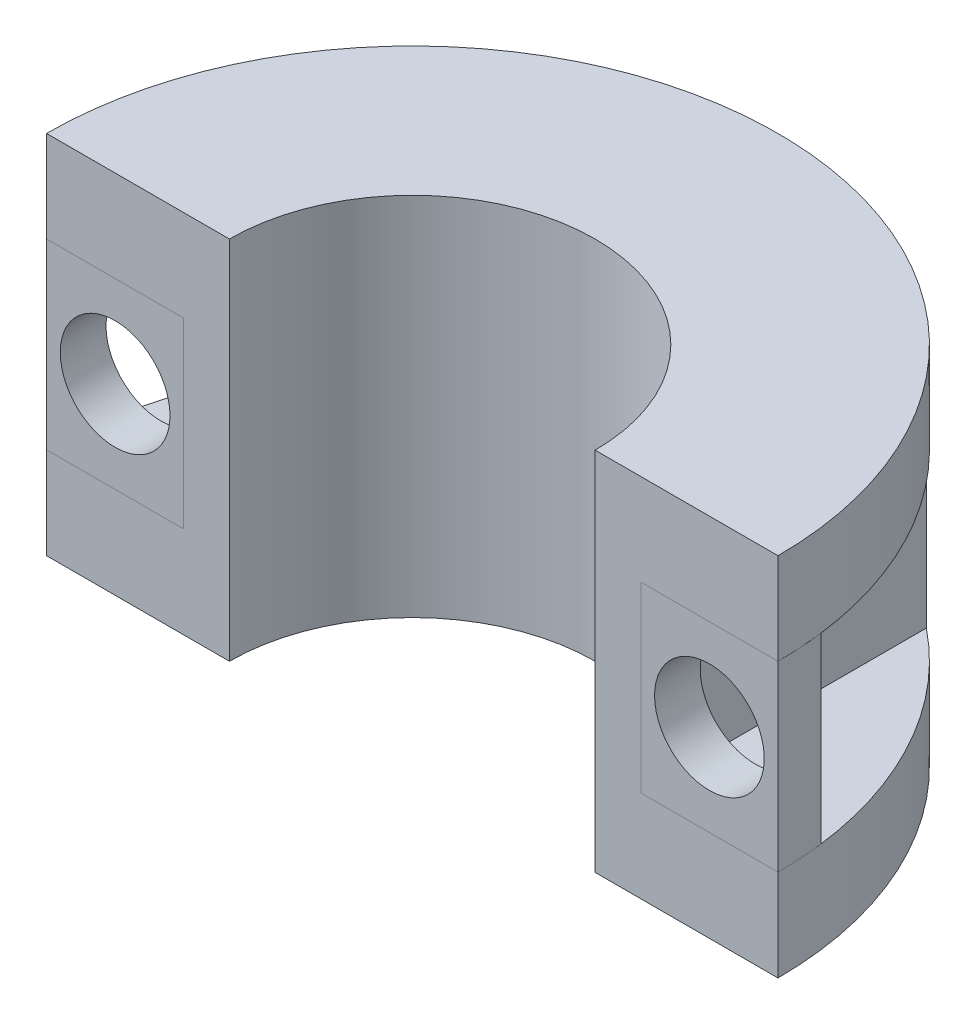
ISO-10303-21;
HEADER;
FILE_DESCRIPTION(('STEP AP214'),'2;1');
FILE_NAME('part.step','',(''),(''),'','','');
FILE_SCHEMA(('AUTOMOTIVE_DESIGN { 1 0 10303 214 1 1 1 1 }'));
ENDSEC;
DATA;
#1=APPLICATION_CONTEXT('core data for automotive mechanical design processes');
#2=APPLICATION_PROTOCOL_DEFINITION('international standard','automotive_design',2000,#1);
#3=PRODUCT_CONTEXT('',#1,'mechanical');
#4=PRODUCT('Part','Part','',(#3));
#5=PRODUCT_RELATED_PRODUCT_CATEGORY('part','',(#4));
#6=PRODUCT_DEFINITION_FORMATION('','',#4);
#7=PRODUCT_DEFINITION_CONTEXT('part definition',#1,'design');
#8=PRODUCT_DEFINITION('design','',#6,#7);
#9=PRODUCT_DEFINITION_SHAPE('','',#8);
#10=(LENGTH_UNIT() NAMED_UNIT(*) SI_UNIT(.MILLI.,.METRE.));
#11=(NAMED_UNIT(*) PLANE_ANGLE_UNIT() SI_UNIT($,.RADIAN.));
#12=(NAMED_UNIT(*) SI_UNIT($,.STERADIAN.) SOLID_ANGLE_UNIT());
#13=UNCERTAINTY_MEASURE_WITH_UNIT(LENGTH_MEASURE(1.E-05),#10,'distance_accuracy_value','');
#14=(GEOMETRIC_REPRESENTATION_CONTEXT(3) GLOBAL_UNCERTAINTY_ASSIGNED_CONTEXT((#13)) GLOBAL_UNIT_ASSIGNED_CONTEXT((#10,
#11,#12)) REPRESENTATION_CONTEXT('',''));
#15=CARTESIAN_POINT('',(0.,0.,0.));
#16=DIRECTION('',(0.,0.,1.));
#17=DIRECTION('',(1.,0.,0.));
#18=AXIS2_PLACEMENT_3D('',#15,#16,#17);
#19=CARTESIAN_POINT('',(5.,6.,0.500000000000001));
#20=DIRECTION('',(0.,1.,0.));
#21=DIRECTION('',(0.,0.,1.));
#22=AXIS2_PLACEMENT_3D('',#19,#20,#21);
#23=PLANE('',#22);
#24=DIRECTION('',(-1.,0.,0.));
#25=VECTOR('',#24,1.);
#26=CARTESIAN_POINT('',(5.,6.,1.5));
#27=LINE('',#26,#25);
#28=CARTESIAN_POINT('',(8.,6.,1.5));
#29=VERTEX_POINT('',#28);
#30=CARTESIAN_POINT('',(5.,6.,1.5));
#31=VERTEX_POINT('',#30);
#32=EDGE_CURVE('E85',#29,#31,#27,.T.);
#33=ORIENTED_EDGE('',*,*,#32,.F.);
#34=CARTESIAN_POINT('',(0.,6.,1.5));
#35=DIRECTION('',(0.,1.,0.));
#36=DIRECTION('',(0.,0.,1.));
#37=AXIS2_PLACEMENT_3D('',#34,#35,#36);
#38=CIRCLE('',#37,8.);
#39=CARTESIAN_POINT('',(7.93725393319377,6.,0.500000000000001));
#40=VERTEX_POINT('',#39);
#41=EDGE_CURVE('E80',#29,#40,#38,.T.);
#42=ORIENTED_EDGE('',*,*,#41,.T.);
#43=DIRECTION('',(-1.,0.,0.));
#44=VECTOR('',#43,1.);
#45=CARTESIAN_POINT('',(5.,6.,0.500000000000001));
#46=LINE('',#45,#44);
#47=CARTESIAN_POINT('',(5.,6.,0.500000000000001));
#48=VERTEX_POINT('',#47);
#49=EDGE_CURVE('E66',#40,#48,#46,.T.);
#50=ORIENTED_EDGE('',*,*,#49,.T.);
#51=DIRECTION('',(0.,0.,1.));
#52=VECTOR('',#51,1.);
#53=CARTESIAN_POINT('',(5.,6.,0.500000000000001));
#54=LINE('',#53,#52);
#55=EDGE_CURVE('E12',#48,#31,#54,.T.);
#56=ORIENTED_EDGE('',*,*,#55,.T.);
#57=EDGE_LOOP('',(#33,#42,#50,#56));
#58=FACE_BOUND('',#57,.T.);
#59=ADVANCED_FACE('F50',(#58),#23,.T.);
#60=CARTESIAN_POINT('',(5.,2.00614686848374,0.500000000000001));
#61=DIRECTION('',(0.,-1.,0.));
#62=DIRECTION('',(0.,0.,-1.));
#63=AXIS2_PLACEMENT_3D('',#60,#61,#62);
#64=PLANE('',#63);
#65=DIRECTION('',(1.,0.,0.));
#66=VECTOR('',#65,1.);
#67=CARTESIAN_POINT('',(5.,2.00614686848374,0.500000000000001));
#68=LINE('',#67,#66);
#69=CARTESIAN_POINT('',(5.,2.00614686848374,0.500000000000001));
#70=VERTEX_POINT('',#69);
#71=CARTESIAN_POINT('',(7.93725393319377,2.00614686848374,0.500000000000001));
#72=VERTEX_POINT('',#71);
#73=EDGE_CURVE('E100',#70,#72,#68,.T.);
#74=ORIENTED_EDGE('',*,*,#73,.T.);
#75=CARTESIAN_POINT('',(0.,2.00614686848374,1.5));
#76=DIRECTION('',(0.,-1.,0.));
#77=DIRECTION('',(0.,0.,-1.));
#78=AXIS2_PLACEMENT_3D('',#75,#76,#77);
#79=CIRCLE('',#78,8.);
#80=CARTESIAN_POINT('',(8.,2.00614686848374,1.5));
#81=VERTEX_POINT('',#80);
#82=EDGE_CURVE('E109',#72,#81,#79,.T.);
#83=ORIENTED_EDGE('',*,*,#82,.T.);
#84=DIRECTION('',(1.,0.,0.));
#85=VECTOR('',#84,1.);
#86=CARTESIAN_POINT('',(5.,2.00614686848374,1.5));
#87=LINE('',#86,#85);
#88=CARTESIAN_POINT('',(5.,2.00614686848374,1.5));
#89=VERTEX_POINT('',#88);
#90=EDGE_CURVE('E94',#89,#81,#87,.T.);
#91=ORIENTED_EDGE('',*,*,#90,.F.);
#92=DIRECTION('',(0.,0.,1.));
#93=VECTOR('',#92,1.);
#94=CARTESIAN_POINT('',(5.,2.00614686848374,0.500000000000001));
#95=LINE('',#94,#93);
#96=EDGE_CURVE('E54',#70,#89,#95,.T.);
#97=ORIENTED_EDGE('',*,*,#96,.F.);
#98=EDGE_LOOP('',(#74,#83,#91,#97));
#99=FACE_BOUND('',#98,.T.);
#100=ADVANCED_FACE('F133',(#99),#64,.T.);
#101=CARTESIAN_POINT('',(0.,0.,0.500000000000001));
#102=DIRECTION('',(0.,0.,1.));
#103=DIRECTION('',(1.,0.,0.));
#104=AXIS2_PLACEMENT_3D('',#101,#102,#103);
#105=PLANE('',#104);
#106=CARTESIAN_POINT('',(6.5,4.00307343424187,0.500000000000001));
#107=DIRECTION('',(0.,0.,-1.));
#108=DIRECTION('',(-1.,0.,0.));
#109=AXIS2_PLACEMENT_3D('',#106,#107,#108);
#110=CIRCLE('',#109,1.2);
#111=CARTESIAN_POINT('',(5.3,4.00307343424187,0.500000000000001));
#112=VERTEX_POINT('',#111);
#113=EDGE_CURVE('E116',#112,#112,#110,.T.);
#114=ORIENTED_EDGE('',*,*,#113,.F.);
#115=EDGE_LOOP('',(#114));
#116=FACE_BOUND('',#115,.T.);
#117=DIRECTION('',(0.,-1.,0.));
#118=VECTOR('',#117,1.);
#119=CARTESIAN_POINT('',(7.93725393319377,8.,0.500000000000001));
#120=LINE('',#119,#118);
#121=EDGE_CURVE('E112',#40,#72,#120,.T.);
#122=ORIENTED_EDGE('',*,*,#121,.T.);
#123=ORIENTED_EDGE('',*,*,#73,.F.);
#124=DIRECTION('',(0.,-1.,0.));
#125=VECTOR('',#124,1.);
#126=CARTESIAN_POINT('',(5.,6.,0.500000000000001));
#127=LINE('',#126,#125);
#128=EDGE_CURVE('E98',#48,#70,#127,.T.);
#129=ORIENTED_EDGE('',*,*,#128,.F.);
#130=ORIENTED_EDGE('',*,*,#49,.F.);
#131=EDGE_LOOP('',(#122,#123,#129,#130));
#132=FACE_BOUND('',#131,.T.);
#133=ADVANCED_FACE('F130',(#116,#132),#105,.F.);
#134=CARTESIAN_POINT('',(5.,6.,0.500000000000001));
#135=DIRECTION('',(-1.,0.,0.));
#136=DIRECTION('',(0.,0.,1.));
#137=AXIS2_PLACEMENT_3D('',#134,#135,#136);
#138=PLANE('',#137);
#139=DIRECTION('',(0.,-1.,0.));
#140=VECTOR('',#139,1.);
#141=CARTESIAN_POINT('',(5.,6.,1.5));
#142=LINE('',#141,#140);
#143=EDGE_CURVE('E90',#31,#89,#142,.T.);
#144=ORIENTED_EDGE('',*,*,#143,.F.);
#145=ORIENTED_EDGE('',*,*,#55,.F.);
#146=ORIENTED_EDGE('',*,*,#128,.T.);
#147=ORIENTED_EDGE('',*,*,#96,.T.);
#148=EDGE_LOOP('',(#144,#145,#146,#147));
#149=FACE_BOUND('',#148,.T.);
#150=ADVANCED_FACE('F52',(#149),#138,.T.);
#151=CARTESIAN_POINT('',(0.,0.,1.5));
#152=DIRECTION('',(0.,0.,1.));
#153=DIRECTION('',(1.,0.,0.));
#154=AXIS2_PLACEMENT_3D('',#151,#152,#153);
#155=PLANE('',#154);
#156=CARTESIAN_POINT('',(6.5,4.00307343424187,1.5));
#157=DIRECTION('',(0.,0.,-1.));
#158=DIRECTION('',(-1.,0.,0.));
#159=AXIS2_PLACEMENT_3D('',#156,#157,#158);
#160=CIRCLE('',#159,1.2);
#161=CARTESIAN_POINT('',(5.3,4.00307343424187,1.5));
#162=VERTEX_POINT('',#161);
#163=EDGE_CURVE('E115',#162,#162,#160,.T.);
#164=ORIENTED_EDGE('',*,*,#163,.T.);
#165=EDGE_LOOP('',(#164));
#166=FACE_BOUND('',#165,.T.);
#167=ORIENTED_EDGE('',*,*,#143,.T.);
#168=ORIENTED_EDGE('',*,*,#90,.T.);
#169=DIRECTION('',(0.,1.,0.));
#170=VECTOR('',#169,1.);
#171=CARTESIAN_POINT('',(8.,6.,1.5));
#172=LINE('',#171,#170);
#173=EDGE_CURVE('E97',#81,#29,#172,.T.);
#174=ORIENTED_EDGE('',*,*,#173,.T.);
#175=ORIENTED_EDGE('',*,*,#32,.T.);
#176=EDGE_LOOP('',(#167,#168,#174,#175));
#177=FACE_BOUND('',#176,.T.);
#178=ADVANCED_FACE('F96',(#166,#177),#155,.T.);
#179=CARTESIAN_POINT('',(0.,8.,1.5));
#180=DIRECTION('',(0.,-1.,0.));
#181=DIRECTION('',(0.,0.,-1.));
#182=AXIS2_PLACEMENT_3D('',#179,#180,#181);
#183=CYLINDRICAL_SURFACE('',#182,8.);
#184=ORIENTED_EDGE('',*,*,#173,.F.);
#185=ORIENTED_EDGE('',*,*,#82,.F.);
#186=ORIENTED_EDGE('',*,*,#121,.F.);
#187=ORIENTED_EDGE('',*,*,#41,.F.);
#188=EDGE_LOOP('',(#184,#185,#186,#187));
#189=FACE_BOUND('',#188,.T.);
#190=ADVANCED_FACE('F126',(#189),#183,.T.);
#191=CARTESIAN_POINT('',(6.5,4.00307343424187,1.5));
#192=DIRECTION('',(0.,0.,-1.));
#193=DIRECTION('',(-1.,0.,0.));
#194=AXIS2_PLACEMENT_3D('',#191,#192,#193);
#195=CYLINDRICAL_SURFACE('',#194,1.2);
#196=ORIENTED_EDGE('',*,*,#163,.F.);
#197=EDGE_LOOP('',(#196));
#198=FACE_BOUND('',#197,.T.);
#199=ORIENTED_EDGE('',*,*,#113,.T.);
#200=EDGE_LOOP('',(#199));
#201=FACE_BOUND('',#200,.T.);
#202=ADVANCED_FACE('F123',(#198,#201),#195,.F.);
#203=CLOSED_SHELL('',(#59,#100,#133,#150,#178,#190,#202));
#204=MANIFOLD_SOLID_BREP('B2',#203);
#205=CARTESIAN_POINT('',(-5.,2.00614686848374,0.500000000000001));
#206=DIRECTION('',(0.,-1.,0.));
#207=DIRECTION('',(0.,0.,-1.));
#208=AXIS2_PLACEMENT_3D('',#205,#206,#207);
#209=PLANE('',#208);
#210=DIRECTION('',(1.,0.,0.));
#211=VECTOR('',#210,1.);
#212=CARTESIAN_POINT('',(-5.,2.00614686848374,1.5));
#213=LINE('',#212,#211);
#214=CARTESIAN_POINT('',(-8.,2.00614686848374,1.5));
#215=VERTEX_POINT('',#214);
#216=CARTESIAN_POINT('',(-5.,2.00614686848374,1.5));
#217=VERTEX_POINT('',#216);
#218=EDGE_CURVE('E242',#215,#217,#213,.T.);
#219=ORIENTED_EDGE('',*,*,#218,.F.);
#220=CARTESIAN_POINT('',(0.,2.00614686848374,1.5));
#221=DIRECTION('',(0.,-1.,0.));
#222=DIRECTION('',(0.,0.,-1.));
#223=AXIS2_PLACEMENT_3D('',#220,#221,#222);
#224=CIRCLE('',#223,8.);
#225=CARTESIAN_POINT('',(-7.93725393319377,2.00614686848374,0.500000000000001));
#226=VERTEX_POINT('',#225);
#227=EDGE_CURVE('E237',#215,#226,#224,.T.);
#228=ORIENTED_EDGE('',*,*,#227,.T.);
#229=DIRECTION('',(1.,0.,0.));
#230=VECTOR('',#229,1.);
#231=CARTESIAN_POINT('',(-5.,2.00614686848374,0.500000000000001));
#232=LINE('',#231,#230);
#233=CARTESIAN_POINT('',(-5.,2.00614686848374,0.500000000000001));
#234=VERTEX_POINT('',#233);
#235=EDGE_CURVE('E223',#226,#234,#232,.T.);
#236=ORIENTED_EDGE('',*,*,#235,.T.);
#237=DIRECTION('',(0.,0.,1.));
#238=VECTOR('',#237,1.);
#239=CARTESIAN_POINT('',(-5.,2.00614686848374,0.500000000000001));
#240=LINE('',#239,#238);
#241=EDGE_CURVE('E48',#234,#217,#240,.T.);
#242=ORIENTED_EDGE('',*,*,#241,.T.);
#243=EDGE_LOOP('',(#219,#228,#236,#242));
#244=FACE_BOUND('',#243,.T.);
#245=ADVANCED_FACE('F207',(#244),#209,.T.);
#246=CARTESIAN_POINT('',(-5.,6.,0.500000000000001));
#247=DIRECTION('',(0.,1.,0.));
#248=DIRECTION('',(0.,0.,1.));
#249=AXIS2_PLACEMENT_3D('',#246,#247,#248);
#250=PLANE('',#249);
#251=DIRECTION('',(-1.,0.,0.));
#252=VECTOR('',#251,1.);
#253=CARTESIAN_POINT('',(-5.,6.,0.500000000000001));
#254=LINE('',#253,#252);
#255=CARTESIAN_POINT('',(-5.,6.,0.500000000000001));
#256=VERTEX_POINT('',#255);
#257=CARTESIAN_POINT('',(-7.93725393319377,6.,0.500000000000001));
#258=VERTEX_POINT('',#257);
#259=EDGE_CURVE('E257',#256,#258,#254,.T.);
#260=ORIENTED_EDGE('',*,*,#259,.T.);
#261=CARTESIAN_POINT('',(0.,6.,1.5));
#262=DIRECTION('',(0.,1.,0.));
#263=DIRECTION('',(0.,0.,1.));
#264=AXIS2_PLACEMENT_3D('',#261,#262,#263);
#265=CIRCLE('',#264,8.);
#266=CARTESIAN_POINT('',(-8.,6.,1.5));
#267=VERTEX_POINT('',#266);
#268=EDGE_CURVE('E266',#258,#267,#265,.T.);
#269=ORIENTED_EDGE('',*,*,#268,.T.);
#270=DIRECTION('',(-1.,0.,0.));
#271=VECTOR('',#270,1.);
#272=CARTESIAN_POINT('',(-5.,6.,1.5));
#273=LINE('',#272,#271);
#274=CARTESIAN_POINT('',(-5.,6.,1.5));
#275=VERTEX_POINT('',#274);
#276=EDGE_CURVE('E251',#275,#267,#273,.T.);
#277=ORIENTED_EDGE('',*,*,#276,.F.);
#278=DIRECTION('',(0.,0.,1.));
#279=VECTOR('',#278,1.);
#280=CARTESIAN_POINT('',(-5.,6.,0.500000000000001));
#281=LINE('',#280,#279);
#282=EDGE_CURVE('E211',#256,#275,#281,.T.);
#283=ORIENTED_EDGE('',*,*,#282,.F.);
#284=EDGE_LOOP('',(#260,#269,#277,#283));
#285=FACE_BOUND('',#284,.T.);
#286=ADVANCED_FACE('F289',(#285),#250,.T.);
#287=CARTESIAN_POINT('',(0.,0.,0.500000000000001));
#288=DIRECTION('',(0.,0.,-1.));
#289=DIRECTION('',(-1.,0.,0.));
#290=AXIS2_PLACEMENT_3D('',#287,#288,#289);
#291=PLANE('',#290);
#292=CARTESIAN_POINT('',(-6.5,4.00307343424187,0.500000000000001));
#293=DIRECTION('',(0.,0.,-1.));
#294=DIRECTION('',(-1.,0.,0.));
#295=AXIS2_PLACEMENT_3D('',#292,#293,#294);
#296=CIRCLE('',#295,1.2);
#297=CARTESIAN_POINT('',(-7.7,4.00307343424187,0.500000000000001));
#298=VERTEX_POINT('',#297);
#299=EDGE_CURVE('E272',#298,#298,#296,.T.);
#300=ORIENTED_EDGE('',*,*,#299,.F.);
#301=EDGE_LOOP('',(#300));
#302=FACE_BOUND('',#301,.T.);
#303=ORIENTED_EDGE('',*,*,#235,.F.);
#304=DIRECTION('',(0.,-1.,0.));
#305=VECTOR('',#304,1.);
#306=CARTESIAN_POINT('',(-7.93725393319377,8.,0.500000000000001));
#307=LINE('',#306,#305);
#308=EDGE_CURVE('E269',#258,#226,#307,.T.);
#309=ORIENTED_EDGE('',*,*,#308,.F.);
#310=ORIENTED_EDGE('',*,*,#259,.F.);
#311=DIRECTION('',(0.,1.,0.));
#312=VECTOR('',#311,1.);
#313=CARTESIAN_POINT('',(-5.,6.,0.500000000000001));
#314=LINE('',#313,#312);
#315=EDGE_CURVE('E255',#234,#256,#314,.T.);
#316=ORIENTED_EDGE('',*,*,#315,.F.);
#317=EDGE_LOOP('',(#303,#309,#310,#316));
#318=FACE_BOUND('',#317,.T.);
#319=ADVANCED_FACE('F286',(#302,#318),#291,.T.);
#320=CARTESIAN_POINT('',(-5.,6.,0.500000000000001));
#321=DIRECTION('',(1.,0.,0.));
#322=DIRECTION('',(0.,0.,-1.));
#323=AXIS2_PLACEMENT_3D('',#320,#321,#322);
#324=PLANE('',#323);
#325=DIRECTION('',(0.,1.,0.));
#326=VECTOR('',#325,1.);
#327=CARTESIAN_POINT('',(-5.,6.,1.5));
#328=LINE('',#327,#326);
#329=EDGE_CURVE('E247',#217,#275,#328,.T.);
#330=ORIENTED_EDGE('',*,*,#329,.F.);
#331=ORIENTED_EDGE('',*,*,#241,.F.);
#332=ORIENTED_EDGE('',*,*,#315,.T.);
#333=ORIENTED_EDGE('',*,*,#282,.T.);
#334=EDGE_LOOP('',(#330,#331,#332,#333));
#335=FACE_BOUND('',#334,.T.);
#336=ADVANCED_FACE('F209',(#335),#324,.T.);
#337=CARTESIAN_POINT('',(0.,0.,1.5));
#338=DIRECTION('',(0.,0.,-1.));
#339=DIRECTION('',(-1.,0.,0.));
#340=AXIS2_PLACEMENT_3D('',#337,#338,#339);
#341=PLANE('',#340);
#342=CARTESIAN_POINT('',(-6.5,4.00307343424187,1.5));
#343=DIRECTION('',(0.,0.,-1.));
#344=DIRECTION('',(-1.,0.,0.));
#345=AXIS2_PLACEMENT_3D('',#342,#343,#344);
#346=CIRCLE('',#345,1.2);
#347=CARTESIAN_POINT('',(-7.7,4.00307343424187,1.5));
#348=VERTEX_POINT('',#347);
#349=EDGE_CURVE('E271',#348,#348,#346,.T.);
#350=ORIENTED_EDGE('',*,*,#349,.T.);
#351=EDGE_LOOP('',(#350));
#352=FACE_BOUND('',#351,.T.);
#353=ORIENTED_EDGE('',*,*,#329,.T.);
#354=ORIENTED_EDGE('',*,*,#276,.T.);
#355=DIRECTION('',(0.,-1.,0.));
#356=VECTOR('',#355,1.);
#357=CARTESIAN_POINT('',(-8.,6.,1.5));
#358=LINE('',#357,#356);
#359=EDGE_CURVE('E254',#267,#215,#358,.T.);
#360=ORIENTED_EDGE('',*,*,#359,.T.);
#361=ORIENTED_EDGE('',*,*,#218,.T.);
#362=EDGE_LOOP('',(#353,#354,#360,#361));
#363=FACE_BOUND('',#362,.T.);
#364=ADVANCED_FACE('F253',(#352,#363),#341,.F.);
#365=CARTESIAN_POINT('',(0.,8.,1.5));
#366=DIRECTION('',(0.,-1.,0.));
#367=DIRECTION('',(0.,0.,-1.));
#368=AXIS2_PLACEMENT_3D('',#365,#366,#367);
#369=CYLINDRICAL_SURFACE('',#368,8.);
#370=ORIENTED_EDGE('',*,*,#359,.F.);
#371=ORIENTED_EDGE('',*,*,#268,.F.);
#372=ORIENTED_EDGE('',*,*,#308,.T.);
#373=ORIENTED_EDGE('',*,*,#227,.F.);
#374=EDGE_LOOP('',(#370,#371,#372,#373));
#375=FACE_BOUND('',#374,.T.);
#376=ADVANCED_FACE('F282',(#375),#369,.T.);
#377=CARTESIAN_POINT('',(-6.5,4.00307343424187,1.5));
#378=DIRECTION('',(0.,0.,-1.));
#379=DIRECTION('',(-1.,0.,0.));
#380=AXIS2_PLACEMENT_3D('',#377,#378,#379);
#381=CYLINDRICAL_SURFACE('',#380,1.2);
#382=ORIENTED_EDGE('',*,*,#349,.F.);
#383=EDGE_LOOP('',(#382));
#384=FACE_BOUND('',#383,.T.);
#385=ORIENTED_EDGE('',*,*,#299,.T.);
#386=EDGE_LOOP('',(#385));
#387=FACE_BOUND('',#386,.T.);
#388=ADVANCED_FACE('F279',(#384,#387),#381,.F.);
#389=CLOSED_SHELL('',(#245,#286,#319,#336,#364,#376,#388));
#390=MANIFOLD_SOLID_BREP('B6',#389);
#391=CARTESIAN_POINT('',(0.,8.,1.5));
#392=DIRECTION('',(0.,-1.,0.));
#393=DIRECTION('',(0.,0.,-1.));
#394=AXIS2_PLACEMENT_3D('',#391,#392,#393);
#395=CYLINDRICAL_SURFACE('',#394,4.);
#396=CARTESIAN_POINT('',(0.,0.,1.5));
#397=DIRECTION('',(0.,-1.,0.));
#398=DIRECTION('',(0.,0.,-1.));
#399=AXIS2_PLACEMENT_3D('',#396,#397,#398);
#400=CIRCLE('',#399,4.);
#401=CARTESIAN_POINT('',(-4.,0.,1.5));
#402=VERTEX_POINT('',#401);
#403=CARTESIAN_POINT('',(4.,0.,1.5));
#404=VERTEX_POINT('',#403);
#405=EDGE_CURVE('E487',#402,#404,#400,.T.);
#406=ORIENTED_EDGE('',*,*,#405,.T.);
#407=DIRECTION('',(0.,-1.,0.));
#408=VECTOR('',#407,1.);
#409=CARTESIAN_POINT('',(4.,8.,1.5));
#410=LINE('',#409,#408);
#411=CARTESIAN_POINT('',(4.,8.,1.5));
#412=VERTEX_POINT('',#411);
#413=EDGE_CURVE('E526',#412,#404,#410,.T.);
#414=ORIENTED_EDGE('',*,*,#413,.F.);
#415=CARTESIAN_POINT('',(0.,8.,1.5));
#416=DIRECTION('',(0.,-1.,0.));
#417=DIRECTION('',(0.,0.,-1.));
#418=AXIS2_PLACEMENT_3D('',#415,#416,#417);
#419=CIRCLE('',#418,4.);
#420=CARTESIAN_POINT('',(-4.,8.,1.5));
#421=VERTEX_POINT('',#420);
#422=EDGE_CURVE('E488',#421,#412,#419,.T.);
#423=ORIENTED_EDGE('',*,*,#422,.F.);
#424=DIRECTION('',(0.,-1.,0.));
#425=VECTOR('',#424,1.);
#426=CARTESIAN_POINT('',(-4.,8.,1.5));
#427=LINE('',#426,#425);
#428=EDGE_CURVE('E502',#421,#402,#427,.T.);
#429=ORIENTED_EDGE('',*,*,#428,.T.);
#430=EDGE_LOOP('',(#406,#414,#423,#429));
#431=FACE_BOUND('',#430,.T.);
#432=ADVANCED_FACE('F355',(#431),#395,.F.);
#433=CARTESIAN_POINT('',(4.,8.,1.5));
#434=DIRECTION('',(0.,0.,-1.));
#435=DIRECTION('',(-1.,0.,0.));
#436=AXIS2_PLACEMENT_3D('',#433,#434,#435);
#437=PLANE('',#436);
#438=DIRECTION('',(0.,-1.,0.));
#439=VECTOR('',#438,1.);
#440=CARTESIAN_POINT('',(8.,8.,1.5));
#441=LINE('',#440,#439);
#442=CARTESIAN_POINT('',(8.,2.00614686848374,1.5));
#443=VERTEX_POINT('',#442);
#444=CARTESIAN_POINT('',(8.,0.,1.5));
#445=VERTEX_POINT('',#444);
#446=EDGE_CURVE('E522',#443,#445,#441,.T.);
#447=ORIENTED_EDGE('',*,*,#446,.F.);
#448=DIRECTION('',(1.,0.,0.));
#449=VECTOR('',#448,1.);
#450=CARTESIAN_POINT('',(8.,2.00614686848374,1.5));
#451=LINE('',#450,#449);
#452=CARTESIAN_POINT('',(5.,2.00614686848374,1.5));
#453=VERTEX_POINT('',#452);
#454=EDGE_CURVE('E471',#453,#443,#451,.T.);
#455=ORIENTED_EDGE('',*,*,#454,.F.);
#456=DIRECTION('',(0.,-1.,0.));
#457=VECTOR('',#456,1.);
#458=CARTESIAN_POINT('',(5.,6.,1.5));
#459=LINE('',#458,#457);
#460=CARTESIAN_POINT('',(5.,6.,1.5));
#461=VERTEX_POINT('',#460);
#462=EDGE_CURVE('E467',#461,#453,#459,.T.);
#463=ORIENTED_EDGE('',*,*,#462,.F.);
#464=DIRECTION('',(-1.,0.,0.));
#465=VECTOR('',#464,1.);
#466=CARTESIAN_POINT('',(8.,6.,1.5));
#467=LINE('',#466,#465);
#468=CARTESIAN_POINT('',(8.,6.,1.5));
#469=VERTEX_POINT('',#468);
#470=EDGE_CURVE('E463',#469,#461,#467,.T.);
#471=ORIENTED_EDGE('',*,*,#470,.F.);
#472=CARTESIAN_POINT('',(8.,8.,1.5));
#473=VERTEX_POINT('',#472);
#474=EDGE_CURVE('E523',#473,#469,#441,.T.);
#475=ORIENTED_EDGE('',*,*,#474,.F.);
#476=DIRECTION('',(1.,0.,0.));
#477=VECTOR('',#476,1.);
#478=CARTESIAN_POINT('',(4.,8.,1.5));
#479=LINE('',#478,#477);
#480=EDGE_CURVE('E492',#412,#473,#479,.T.);
#481=ORIENTED_EDGE('',*,*,#480,.F.);
#482=ORIENTED_EDGE('',*,*,#413,.T.);
#483=DIRECTION('',(1.,0.,0.));
#484=VECTOR('',#483,1.);
#485=CARTESIAN_POINT('',(4.,0.,1.5));
#486=LINE('',#485,#484);
#487=EDGE_CURVE('E506',#404,#445,#486,.T.);
#488=ORIENTED_EDGE('',*,*,#487,.T.);
#489=EDGE_LOOP('',(#447,#455,#463,#471,#475,#481,#482,#488));
#490=FACE_BOUND('',#489,.T.);
#491=ADVANCED_FACE('F543',(#490),#437,.F.);
#492=CARTESIAN_POINT('',(0.,8.,1.5));
#493=DIRECTION('',(0.,-1.,0.));
#494=DIRECTION('',(0.,0.,-1.));
#495=AXIS2_PLACEMENT_3D('',#492,#493,#494);
#496=CYLINDRICAL_SURFACE('',#495,8.);
#497=CARTESIAN_POINT('',(0.,6.,1.5));
#498=DIRECTION('',(0.,1.,0.));
#499=DIRECTION('',(0.,0.,1.));
#500=AXIS2_PLACEMENT_3D('',#497,#498,#499);
#501=CIRCLE('',#500,8.);
#502=CARTESIAN_POINT('',(5.,6.,-4.7449979983984));
#503=VERTEX_POINT('',#502);
#504=EDGE_CURVE('E370',#469,#503,#501,.T.);
#505=ORIENTED_EDGE('',*,*,#504,.T.);
#506=DIRECTION('',(0.,-1.,0.));
#507=VECTOR('',#506,1.);
#508=CARTESIAN_POINT('',(5.,8.,-4.7449979983984));
#509=LINE('',#508,#507);
#510=CARTESIAN_POINT('',(5.,2.00614686848374,-4.7449979983984));
#511=VERTEX_POINT('',#510);
#512=EDGE_CURVE('E363',#503,#511,#509,.T.);
#513=ORIENTED_EDGE('',*,*,#512,.T.);
#514=CARTESIAN_POINT('',(0.,2.00614686848374,1.5));
#515=DIRECTION('',(0.,-1.,0.));
#516=DIRECTION('',(1.,0.,0.));
#517=AXIS2_PLACEMENT_3D('',#514,#515,#516);
#518=CIRCLE('',#517,8.);
#519=EDGE_CURVE('E205',#511,#443,#518,.T.);
#520=ORIENTED_EDGE('',*,*,#519,.T.);
#521=ORIENTED_EDGE('',*,*,#446,.T.);
#522=CARTESIAN_POINT('',(0.,0.,1.5));
#523=DIRECTION('',(0.,1.,0.));
#524=DIRECTION('',(0.,0.,-1.));
#525=AXIS2_PLACEMENT_3D('',#522,#523,#524);
#526=CIRCLE('',#525,8.);
#527=CARTESIAN_POINT('',(-8.,0.,1.5));
#528=VERTEX_POINT('',#527);
#529=EDGE_CURVE('E510',#445,#528,#526,.T.);
#530=ORIENTED_EDGE('',*,*,#529,.T.);
#531=DIRECTION('',(0.,-1.,0.));
#532=VECTOR('',#531,1.);
#533=CARTESIAN_POINT('',(-8.,8.,1.5));
#534=LINE('',#533,#532);
#535=CARTESIAN_POINT('',(-8.,2.00614686848374,1.5));
#536=VERTEX_POINT('',#535);
#537=EDGE_CURVE('E518',#536,#528,#534,.T.);
#538=ORIENTED_EDGE('',*,*,#537,.F.);
#539=CARTESIAN_POINT('',(0.,2.00614686848374,1.5));
#540=DIRECTION('',(0.,-1.,0.));
#541=DIRECTION('',(0.,0.,-1.));
#542=AXIS2_PLACEMENT_3D('',#539,#540,#541);
#543=CIRCLE('',#542,8.);
#544=CARTESIAN_POINT('',(-5.,2.00614686848374,-4.7449979983984));
#545=VERTEX_POINT('',#544);
#546=EDGE_CURVE('E378',#536,#545,#543,.T.);
#547=ORIENTED_EDGE('',*,*,#546,.T.);
#548=DIRECTION('',(0.,-1.,0.));
#549=VECTOR('',#548,1.);
#550=CARTESIAN_POINT('',(-5.,8.,-4.7449979983984));
#551=LINE('',#550,#549);
#552=CARTESIAN_POINT('',(-5.,6.,-4.7449979983984));
#553=VERTEX_POINT('',#552);
#554=EDGE_CURVE('E440',#545,#553,#551,.F.);
#555=ORIENTED_EDGE('',*,*,#554,.T.);
#556=CARTESIAN_POINT('',(0.,6.,1.5));
#557=DIRECTION('',(0.,1.,0.));
#558=DIRECTION('',(0.,0.,1.));
#559=AXIS2_PLACEMENT_3D('',#556,#557,#558);
#560=CIRCLE('',#559,8.);
#561=CARTESIAN_POINT('',(-8.,6.,1.5));
#562=VERTEX_POINT('',#561);
#563=EDGE_CURVE('E484',#553,#562,#560,.T.);
#564=ORIENTED_EDGE('',*,*,#563,.T.);
#565=CARTESIAN_POINT('',(-8.,8.,1.5));
#566=VERTEX_POINT('',#565);
#567=EDGE_CURVE('E519',#566,#562,#534,.T.);
#568=ORIENTED_EDGE('',*,*,#567,.F.);
#569=CARTESIAN_POINT('',(0.,8.,1.5));
#570=DIRECTION('',(0.,1.,0.));
#571=DIRECTION('',(0.,0.,-1.));
#572=AXIS2_PLACEMENT_3D('',#569,#570,#571);
#573=CIRCLE('',#572,8.);
#574=EDGE_CURVE('E496',#473,#566,#573,.T.);
#575=ORIENTED_EDGE('',*,*,#574,.F.);
#576=ORIENTED_EDGE('',*,*,#474,.T.);
#577=EDGE_LOOP('',(#505,#513,#520,#521,#530,#538,#547,#555,#564,#568,#575,#576));
#578=FACE_BOUND('',#577,.T.);
#579=ADVANCED_FACE('F533',(#578),#496,.T.);
#580=CARTESIAN_POINT('',(-8.,8.,1.5));
#581=DIRECTION('',(0.,0.,-1.));
#582=DIRECTION('',(-1.,0.,0.));
#583=AXIS2_PLACEMENT_3D('',#580,#581,#582);
#584=PLANE('',#583);
#585=ORIENTED_EDGE('',*,*,#567,.T.);
#586=DIRECTION('',(-1.,0.,0.));
#587=VECTOR('',#586,1.);
#588=CARTESIAN_POINT('',(-8.,6.,1.5));
#589=LINE('',#588,#587);
#590=CARTESIAN_POINT('',(-5.,6.,1.5));
#591=VERTEX_POINT('',#590);
#592=EDGE_CURVE('E443',#591,#562,#589,.T.);
#593=ORIENTED_EDGE('',*,*,#592,.F.);
#594=DIRECTION('',(0.,1.,0.));
#595=VECTOR('',#594,1.);
#596=CARTESIAN_POINT('',(-5.,6.,1.5));
#597=LINE('',#596,#595);
#598=CARTESIAN_POINT('',(-5.,2.00614686848374,1.5));
#599=VERTEX_POINT('',#598);
#600=EDGE_CURVE('E437',#599,#591,#597,.T.);
#601=ORIENTED_EDGE('',*,*,#600,.F.);
#602=DIRECTION('',(1.,0.,0.));
#603=VECTOR('',#602,1.);
#604=CARTESIAN_POINT('',(-5.,2.00614686848374,1.5));
#605=LINE('',#604,#603);
#606=EDGE_CURVE('E445',#536,#599,#605,.T.);
#607=ORIENTED_EDGE('',*,*,#606,.F.);
#608=ORIENTED_EDGE('',*,*,#537,.T.);
#609=DIRECTION('',(1.,0.,0.));
#610=VECTOR('',#609,1.);
#611=CARTESIAN_POINT('',(-8.,0.,1.5));
#612=LINE('',#611,#610);
#613=EDGE_CURVE('E493',#528,#402,#612,.T.);
#614=ORIENTED_EDGE('',*,*,#613,.T.);
#615=ORIENTED_EDGE('',*,*,#428,.F.);
#616=DIRECTION('',(1.,0.,0.));
#617=VECTOR('',#616,1.);
#618=CARTESIAN_POINT('',(-8.,8.,1.5));
#619=LINE('',#618,#617);
#620=EDGE_CURVE('E499',#566,#421,#619,.T.);
#621=ORIENTED_EDGE('',*,*,#620,.F.);
#622=EDGE_LOOP('',(#585,#593,#601,#607,#608,#614,#615,#621));
#623=FACE_BOUND('',#622,.T.);
#624=ADVANCED_FACE('F454',(#623),#584,.F.);
#625=CARTESIAN_POINT('',(0.,8.,1.5));
#626=DIRECTION('',(0.,-1.,0.));
#627=DIRECTION('',(0.,0.,-1.));
#628=AXIS2_PLACEMENT_3D('',#625,#626,#627);
#629=PLANE('',#628);
#630=ORIENTED_EDGE('',*,*,#422,.T.);
#631=ORIENTED_EDGE('',*,*,#480,.T.);
#632=ORIENTED_EDGE('',*,*,#574,.T.);
#633=ORIENTED_EDGE('',*,*,#620,.T.);
#634=EDGE_LOOP('',(#630,#631,#632,#633));
#635=FACE_BOUND('',#634,.T.);
#636=ADVANCED_FACE('F558',(#635),#629,.F.);
#637=CARTESIAN_POINT('',(0.,0.,1.5));
#638=DIRECTION('',(0.,-1.,0.));
#639=DIRECTION('',(0.,0.,-1.));
#640=AXIS2_PLACEMENT_3D('',#637,#638,#639);
#641=PLANE('',#640);
#642=ORIENTED_EDGE('',*,*,#405,.F.);
#643=ORIENTED_EDGE('',*,*,#613,.F.);
#644=ORIENTED_EDGE('',*,*,#529,.F.);
#645=ORIENTED_EDGE('',*,*,#487,.F.);
#646=EDGE_LOOP('',(#642,#643,#644,#645));
#647=FACE_BOUND('',#646,.T.);
#648=ADVANCED_FACE('F551',(#647),#641,.T.);
#649=CARTESIAN_POINT('',(-8.,6.,-8.5));
#650=DIRECTION('',(0.,1.,0.));
#651=DIRECTION('',(0.,0.,1.));
#652=AXIS2_PLACEMENT_3D('',#649,#650,#651);
#653=PLANE('',#652);
#654=DIRECTION('',(0.,0.,1.));
#655=VECTOR('',#654,1.);
#656=CARTESIAN_POINT('',(-5.,6.,-8.5));
#657=LINE('',#656,#655);
#658=EDGE_CURVE('E442',#553,#591,#657,.T.);
#659=ORIENTED_EDGE('',*,*,#658,.T.);
#660=ORIENTED_EDGE('',*,*,#592,.T.);
#661=ORIENTED_EDGE('',*,*,#563,.F.);
#662=EDGE_LOOP('',(#659,#660,#661));
#663=FACE_BOUND('',#662,.T.);
#664=ADVANCED_FACE('F562',(#663),#653,.F.);
#665=CARTESIAN_POINT('',(-5.,6.,-8.5));
#666=DIRECTION('',(1.,0.,0.));
#667=DIRECTION('',(0.,0.,-1.));
#668=AXIS2_PLACEMENT_3D('',#665,#666,#667);
#669=PLANE('',#668);
#670=DIRECTION('',(0.,0.,1.));
#671=VECTOR('',#670,1.);
#672=CARTESIAN_POINT('',(-5.,2.00614686848374,-8.5));
#673=LINE('',#672,#671);
#674=EDGE_CURVE('E433',#545,#599,#673,.T.);
#675=ORIENTED_EDGE('',*,*,#674,.T.);
#676=ORIENTED_EDGE('',*,*,#600,.T.);
#677=ORIENTED_EDGE('',*,*,#658,.F.);
#678=ORIENTED_EDGE('',*,*,#554,.F.);
#679=EDGE_LOOP('',(#675,#676,#677,#678));
#680=FACE_BOUND('',#679,.T.);
#681=ADVANCED_FACE('F434',(#680),#669,.F.);
#682=CARTESIAN_POINT('',(-5.,2.00614686848374,-8.5));
#683=DIRECTION('',(0.,-1.,0.));
#684=DIRECTION('',(0.,0.,-1.));
#685=AXIS2_PLACEMENT_3D('',#682,#683,#684);
#686=PLANE('',#685);
#687=ORIENTED_EDGE('',*,*,#606,.T.);
#688=ORIENTED_EDGE('',*,*,#674,.F.);
#689=ORIENTED_EDGE('',*,*,#546,.F.);
#690=EDGE_LOOP('',(#687,#688,#689));
#691=FACE_BOUND('',#690,.T.);
#692=ADVANCED_FACE('F446',(#691),#686,.F.);
#693=CARTESIAN_POINT('',(8.,2.00614686848374,-8.5));
#694=DIRECTION('',(0.,-1.,0.));
#695=DIRECTION('',(1.,0.,0.));
#696=AXIS2_PLACEMENT_3D('',#693,#694,#695);
#697=PLANE('',#696);
#698=DIRECTION('',(0.,0.,1.));
#699=VECTOR('',#698,1.);
#700=CARTESIAN_POINT('',(5.,2.00614686848374,-8.5));
#701=LINE('',#700,#699);
#702=EDGE_CURVE('E451',#511,#453,#701,.T.);
#703=ORIENTED_EDGE('',*,*,#702,.T.);
#704=ORIENTED_EDGE('',*,*,#454,.T.);
#705=ORIENTED_EDGE('',*,*,#519,.F.);
#706=EDGE_LOOP('',(#703,#704,#705));
#707=FACE_BOUND('',#706,.T.);
#708=ADVANCED_FACE('F540',(#707),#697,.F.);
#709=CARTESIAN_POINT('',(5.,6.,-8.5));
#710=DIRECTION('',(-1.,0.,0.));
#711=DIRECTION('',(0.,-1.,0.));
#712=AXIS2_PLACEMENT_3D('',#709,#710,#711);
#713=PLANE('',#712);
#714=DIRECTION('',(0.,0.,1.));
#715=VECTOR('',#714,1.);
#716=CARTESIAN_POINT('',(5.,6.,-8.5));
#717=LINE('',#716,#715);
#718=EDGE_CURVE('E475',#503,#461,#717,.T.);
#719=ORIENTED_EDGE('',*,*,#718,.T.);
#720=ORIENTED_EDGE('',*,*,#462,.T.);
#721=ORIENTED_EDGE('',*,*,#702,.F.);
#722=ORIENTED_EDGE('',*,*,#512,.F.);
#723=EDGE_LOOP('',(#719,#720,#721,#722));
#724=FACE_BOUND('',#723,.T.);
#725=ADVANCED_FACE('F536',(#724),#713,.F.);
#726=CARTESIAN_POINT('',(8.,6.,-8.5));
#727=DIRECTION('',(0.,1.,0.));
#728=DIRECTION('',(0.,0.,1.));
#729=AXIS2_PLACEMENT_3D('',#726,#727,#728);
#730=PLANE('',#729);
#731=ORIENTED_EDGE('',*,*,#470,.T.);
#732=ORIENTED_EDGE('',*,*,#718,.F.);
#733=ORIENTED_EDGE('',*,*,#504,.F.);
#734=EDGE_LOOP('',(#731,#732,#733));
#735=FACE_BOUND('',#734,.T.);
#736=ADVANCED_FACE('F584',(#735),#730,.F.);
#737=CLOSED_SHELL('',(#432,#491,#579,#624,#636,#648,#664,#681,#692,#708,#725,#736));
#738=MANIFOLD_SOLID_BREP('B42',#737);
#739=ADVANCED_BREP_SHAPE_REPRESENTATION('',(#18,#204,#390,#738),#14);
#740=SHAPE_DEFINITION_REPRESENTATION(#9,#739);
ENDSEC;
END-ISO-10303-21;
